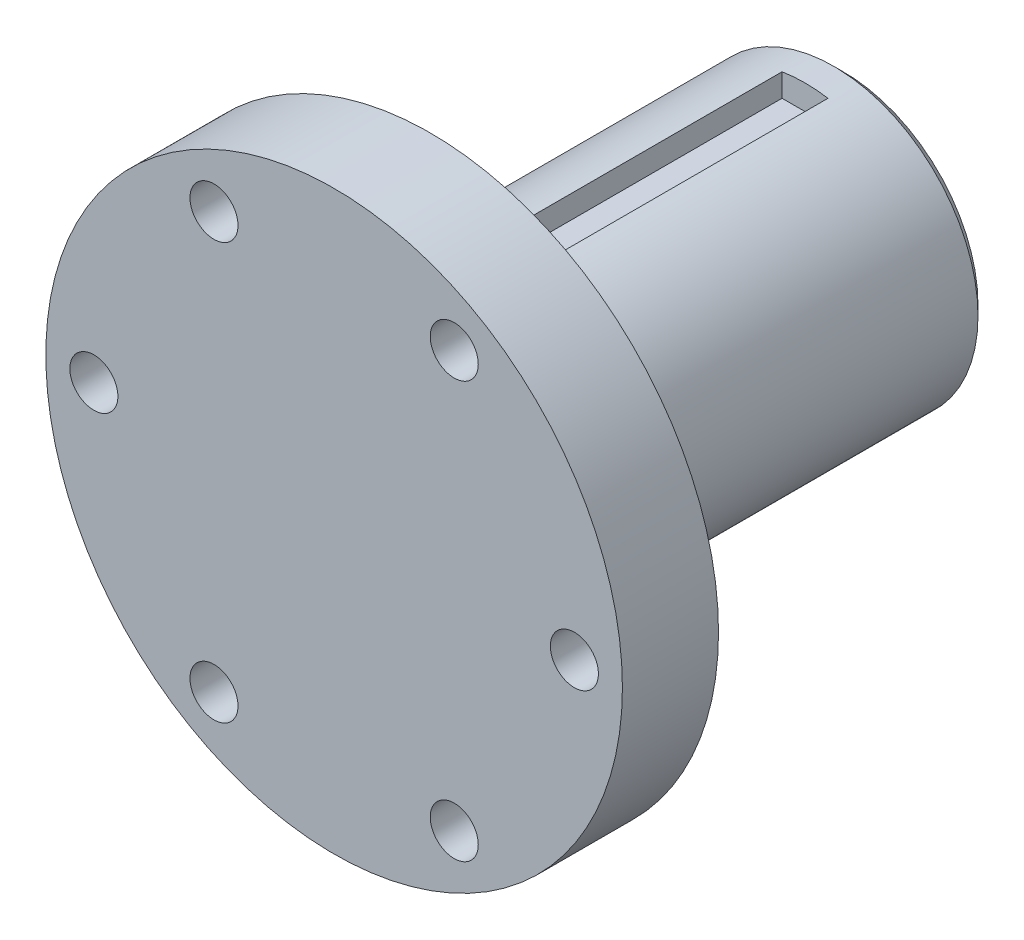
ISO-10303-21;
HEADER;
FILE_DESCRIPTION(('STEP AP214'),'2;1');
FILE_NAME('part.step','',(''),(''),'','','');
FILE_SCHEMA(('AUTOMOTIVE_DESIGN { 1 0 10303 214 1 1 1 1 }'));
ENDSEC;
DATA;
#1=APPLICATION_CONTEXT('core data for automotive mechanical design processes');
#2=APPLICATION_PROTOCOL_DEFINITION('international standard','automotive_design',2000,#1);
#3=PRODUCT_CONTEXT('',#1,'mechanical');
#4=PRODUCT('Part','Part','',(#3));
#5=PRODUCT_RELATED_PRODUCT_CATEGORY('part','',(#4));
#6=PRODUCT_DEFINITION_FORMATION('','',#4);
#7=PRODUCT_DEFINITION_CONTEXT('part definition',#1,'design');
#8=PRODUCT_DEFINITION('design','',#6,#7);
#9=PRODUCT_DEFINITION_SHAPE('','',#8);
#10=(LENGTH_UNIT() NAMED_UNIT(*) SI_UNIT(.MILLI.,.METRE.));
#11=(NAMED_UNIT(*) PLANE_ANGLE_UNIT() SI_UNIT($,.RADIAN.));
#12=(NAMED_UNIT(*) SI_UNIT($,.STERADIAN.) SOLID_ANGLE_UNIT());
#13=UNCERTAINTY_MEASURE_WITH_UNIT(LENGTH_MEASURE(1.E-05),#10,'distance_accuracy_value','');
#14=(GEOMETRIC_REPRESENTATION_CONTEXT(3) GLOBAL_UNCERTAINTY_ASSIGNED_CONTEXT((#13)) GLOBAL_UNIT_ASSIGNED_CONTEXT((#10,
#11,#12)) REPRESENTATION_CONTEXT('',''));
#15=CARTESIAN_POINT('',(0.,0.,0.));
#16=DIRECTION('',(0.,0.,1.));
#17=DIRECTION('',(1.,0.,0.));
#18=AXIS2_PLACEMENT_3D('',#15,#16,#17);
#19=CARTESIAN_POINT('',(0.,0.,53.));
#20=DIRECTION('',(0.,0.,-1.));
#21=DIRECTION('',(-1.,0.,0.));
#22=AXIS2_PLACEMENT_3D('',#19,#20,#21);
#23=CYLINDRICAL_SURFACE('',#22,15.);
#24=CARTESIAN_POINT('',(0.,0.,39.));
#25=DIRECTION('',(0.,0.,-1.));
#26=DIRECTION('',(-1.,0.,0.));
#27=AXIS2_PLACEMENT_3D('',#24,#25,#26);
#28=CIRCLE('',#27,15.);
#29=CARTESIAN_POINT('',(-2.39,14.8083726317243,39.));
#30=VERTEX_POINT('',#29);
#31=CARTESIAN_POINT('',(2.39,14.8083726317243,39.));
#32=VERTEX_POINT('',#31);
#33=EDGE_CURVE('E100',#30,#32,#28,.T.);
#34=ORIENTED_EDGE('',*,*,#33,.F.);
#35=DIRECTION('',(0.,0.,-1.));
#36=VECTOR('',#35,1.);
#37=CARTESIAN_POINT('',(-2.39,14.8083726317243,39.));
#38=LINE('',#37,#36);
#39=CARTESIAN_POINT('',(-2.39,14.8083726317243,4.));
#40=VERTEX_POINT('',#39);
#41=EDGE_CURVE('E60',#30,#40,#38,.T.);
#42=ORIENTED_EDGE('',*,*,#41,.T.);
#43=CARTESIAN_POINT('',(0.,0.,4.));
#44=DIRECTION('',(0.,0.,-1.));
#45=DIRECTION('',(-1.,0.,0.));
#46=AXIS2_PLACEMENT_3D('',#43,#44,#45);
#47=CIRCLE('',#46,15.);
#48=CARTESIAN_POINT('',(2.39,14.8083726317243,4.));
#49=VERTEX_POINT('',#48);
#50=EDGE_CURVE('E76',#40,#49,#47,.T.);
#51=ORIENTED_EDGE('',*,*,#50,.T.);
#52=DIRECTION('',(0.,0.,-1.));
#53=VECTOR('',#52,1.);
#54=CARTESIAN_POINT('',(2.39,14.8083726317243,39.));
#55=LINE('',#54,#53);
#56=EDGE_CURVE('E90',#32,#49,#55,.T.);
#57=ORIENTED_EDGE('',*,*,#56,.F.);
#58=EDGE_LOOP('',(#34,#42,#51,#57));
#59=FACE_BOUND('',#58,.T.);
#60=CARTESIAN_POINT('',(0.,0.,0.999999999999994));
#61=DIRECTION('',(0.,0.,1.));
#62=DIRECTION('',(1.,0.,0.));
#63=AXIS2_PLACEMENT_3D('',#60,#61,#62);
#64=CIRCLE('',#63,15.);
#65=CARTESIAN_POINT('',(15.,0.,0.999999999999994));
#66=VERTEX_POINT('',#65);
#67=EDGE_CURVE('E115',#66,#66,#64,.T.);
#68=ORIENTED_EDGE('',*,*,#67,.T.);
#69=EDGE_LOOP('',(#68));
#70=FACE_BOUND('',#69,.T.);
#71=CARTESIAN_POINT('',(0.,0.,43.));
#72=DIRECTION('',(0.,0.,1.));
#73=DIRECTION('',(1.,0.,0.));
#74=AXIS2_PLACEMENT_3D('',#71,#72,#73);
#75=CIRCLE('',#74,15.);
#76=CARTESIAN_POINT('',(15.,0.,43.));
#77=VERTEX_POINT('',#76);
#78=EDGE_CURVE('E11',#77,#77,#75,.T.);
#79=ORIENTED_EDGE('',*,*,#78,.F.);
#80=EDGE_LOOP('',(#79));
#81=FACE_BOUND('',#80,.T.);
#82=ADVANCED_FACE('F35',(#59,#70,#81),#23,.T.);
#83=CARTESIAN_POINT('',(0.,0.,0.));
#84=DIRECTION('',(0.,0.,1.));
#85=DIRECTION('',(1.,0.,0.));
#86=AXIS2_PLACEMENT_3D('',#83,#84,#85);
#87=PLANE('',#86);
#88=CARTESIAN_POINT('',(0.,0.,0.));
#89=DIRECTION('',(0.,0.,1.));
#90=DIRECTION('',(1.,0.,0.));
#91=AXIS2_PLACEMENT_3D('',#88,#89,#90);
#92=CIRCLE('',#91,14.);
#93=CARTESIAN_POINT('',(14.,0.,0.));
#94=VERTEX_POINT('',#93);
#95=EDGE_CURVE('E44',#94,#94,#92,.F.);
#96=ORIENTED_EDGE('',*,*,#95,.T.);
#97=EDGE_LOOP('',(#96));
#98=FACE_BOUND('',#97,.T.);
#99=ADVANCED_FACE('F122',(#98),#87,.F.);
#100=CARTESIAN_POINT('',(0.,0.,0.999999999999994));
#101=DIRECTION('',(0.,0.,1.));
#102=DIRECTION('',(1.,0.,0.));
#103=AXIS2_PLACEMENT_3D('',#100,#101,#102);
#104=CONICAL_SURFACE('',#103,15.,0.785398163397451);
#105=ORIENTED_EDGE('',*,*,#95,.F.);
#106=EDGE_LOOP('',(#105));
#107=FACE_BOUND('',#106,.T.);
#108=ORIENTED_EDGE('',*,*,#67,.F.);
#109=EDGE_LOOP('',(#108));
#110=FACE_BOUND('',#109,.T.);
#111=ADVANCED_FACE('F38',(#107,#110),#104,.T.);
#112=CARTESIAN_POINT('',(-2.39,12.4183726317243,39.));
#113=DIRECTION('',(-1.,0.,0.));
#114=DIRECTION('',(0.,-1.,0.));
#115=AXIS2_PLACEMENT_3D('',#112,#113,#114);
#116=PLANE('',#115);
#117=DIRECTION('',(0.,1.,0.));
#118=VECTOR('',#117,1.);
#119=CARTESIAN_POINT('',(-2.39,12.4183726317243,4.));
#120=LINE('',#119,#118);
#121=CARTESIAN_POINT('',(-2.39,12.4183726317243,4.));
#122=VERTEX_POINT('',#121);
#123=EDGE_CURVE('E103',#122,#40,#120,.T.);
#124=ORIENTED_EDGE('',*,*,#123,.T.);
#125=ORIENTED_EDGE('',*,*,#41,.F.);
#126=DIRECTION('',(0.,1.,0.));
#127=VECTOR('',#126,1.);
#128=CARTESIAN_POINT('',(-2.39,12.4183726317243,39.));
#129=LINE('',#128,#127);
#130=CARTESIAN_POINT('',(-2.39,12.4183726317243,39.));
#131=VERTEX_POINT('',#130);
#132=EDGE_CURVE('E96',#131,#30,#129,.T.);
#133=ORIENTED_EDGE('',*,*,#132,.F.);
#134=DIRECTION('',(0.,0.,-1.));
#135=VECTOR('',#134,1.);
#136=CARTESIAN_POINT('',(-2.39,12.4183726317243,39.));
#137=LINE('',#136,#135);
#138=EDGE_CURVE('E89',#131,#122,#137,.T.);
#139=ORIENTED_EDGE('',*,*,#138,.T.);
#140=EDGE_LOOP('',(#124,#125,#133,#139));
#141=FACE_BOUND('',#140,.T.);
#142=ADVANCED_FACE('F126',(#141),#116,.F.);
#143=CARTESIAN_POINT('',(2.39,12.4183726317243,39.));
#144=DIRECTION('',(0.,-1.,0.));
#145=DIRECTION('',(0.,0.,-1.));
#146=AXIS2_PLACEMENT_3D('',#143,#144,#145);
#147=PLANE('',#146);
#148=DIRECTION('',(-1.,0.,0.));
#149=VECTOR('',#148,1.);
#150=CARTESIAN_POINT('',(2.39,12.4183726317243,4.));
#151=LINE('',#150,#149);
#152=CARTESIAN_POINT('',(2.39,12.4183726317243,4.));
#153=VERTEX_POINT('',#152);
#154=EDGE_CURVE('E111',#153,#122,#151,.T.);
#155=ORIENTED_EDGE('',*,*,#154,.T.);
#156=ORIENTED_EDGE('',*,*,#138,.F.);
#157=DIRECTION('',(-1.,0.,0.));
#158=VECTOR('',#157,1.);
#159=CARTESIAN_POINT('',(2.39,12.4183726317243,39.));
#160=LINE('',#159,#158);
#161=CARTESIAN_POINT('',(2.39,12.4183726317243,39.));
#162=VERTEX_POINT('',#161);
#163=EDGE_CURVE('E93',#162,#131,#160,.T.);
#164=ORIENTED_EDGE('',*,*,#163,.F.);
#165=DIRECTION('',(0.,0.,-1.));
#166=VECTOR('',#165,1.);
#167=CARTESIAN_POINT('',(2.39,12.4183726317243,39.));
#168=LINE('',#167,#166);
#169=EDGE_CURVE('E84',#162,#153,#168,.T.);
#170=ORIENTED_EDGE('',*,*,#169,.T.);
#171=EDGE_LOOP('',(#155,#156,#164,#170));
#172=FACE_BOUND('',#171,.T.);
#173=ADVANCED_FACE('F94',(#172),#147,.F.);
#174=CARTESIAN_POINT('',(2.39,14.8083726317243,39.));
#175=DIRECTION('',(1.,0.,0.));
#176=DIRECTION('',(0.,1.,0.));
#177=AXIS2_PLACEMENT_3D('',#174,#175,#176);
#178=PLANE('',#177);
#179=DIRECTION('',(0.,-1.,0.));
#180=VECTOR('',#179,1.);
#181=CARTESIAN_POINT('',(2.39,14.8083726317243,4.));
#182=LINE('',#181,#180);
#183=EDGE_CURVE('E51',#49,#153,#182,.T.);
#184=ORIENTED_EDGE('',*,*,#183,.T.);
#185=ORIENTED_EDGE('',*,*,#169,.F.);
#186=DIRECTION('',(0.,-1.,0.));
#187=VECTOR('',#186,1.);
#188=CARTESIAN_POINT('',(2.39,14.8083726317243,39.));
#189=LINE('',#188,#187);
#190=EDGE_CURVE('E82',#32,#162,#189,.T.);
#191=ORIENTED_EDGE('',*,*,#190,.F.);
#192=ORIENTED_EDGE('',*,*,#56,.T.);
#193=EDGE_LOOP('',(#184,#185,#191,#192));
#194=FACE_BOUND('',#193,.T.);
#195=ADVANCED_FACE('F86',(#194),#178,.F.);
#196=CARTESIAN_POINT('',(0.,0.,39.));
#197=DIRECTION('',(0.,0.,-1.));
#198=DIRECTION('',(-1.,0.,0.));
#199=AXIS2_PLACEMENT_3D('',#196,#197,#198);
#200=PLANE('',#199);
#201=ORIENTED_EDGE('',*,*,#33,.T.);
#202=ORIENTED_EDGE('',*,*,#190,.T.);
#203=ORIENTED_EDGE('',*,*,#163,.T.);
#204=ORIENTED_EDGE('',*,*,#132,.T.);
#205=EDGE_LOOP('',(#201,#202,#203,#204));
#206=FACE_BOUND('',#205,.T.);
#207=ADVANCED_FACE('F98',(#206),#200,.T.);
#208=CARTESIAN_POINT('',(0.,0.,4.));
#209=DIRECTION('',(0.,0.,-1.));
#210=DIRECTION('',(-1.,0.,0.));
#211=AXIS2_PLACEMENT_3D('',#208,#209,#210);
#212=PLANE('',#211);
#213=ORIENTED_EDGE('',*,*,#50,.F.);
#214=ORIENTED_EDGE('',*,*,#123,.F.);
#215=ORIENTED_EDGE('',*,*,#154,.F.);
#216=ORIENTED_EDGE('',*,*,#183,.F.);
#217=EDGE_LOOP('',(#213,#214,#215,#216));
#218=FACE_BOUND('',#217,.T.);
#219=ADVANCED_FACE('F217',(#218),#212,.F.);
#220=CARTESIAN_POINT('',(0.,0.,43.));
#221=DIRECTION('',(0.,0.,1.));
#222=DIRECTION('',(1.,0.,0.));
#223=AXIS2_PLACEMENT_3D('',#220,#221,#222);
#224=CYLINDRICAL_SURFACE('',#223,30.);
#225=CARTESIAN_POINT('',(0.,0.,43.));
#226=DIRECTION('',(0.,0.,1.));
#227=DIRECTION('',(1.,0.,0.));
#228=AXIS2_PLACEMENT_3D('',#225,#226,#227);
#229=CIRCLE('',#228,30.);
#230=CARTESIAN_POINT('',(30.,0.,43.));
#231=VERTEX_POINT('',#230);
#232=EDGE_CURVE('E109',#231,#231,#229,.T.);
#233=ORIENTED_EDGE('',*,*,#232,.T.);
#234=EDGE_LOOP('',(#233));
#235=FACE_BOUND('',#234,.T.);
#236=CARTESIAN_POINT('',(0.,0.,53.));
#237=DIRECTION('',(0.,0.,1.));
#238=DIRECTION('',(1.,0.,0.));
#239=AXIS2_PLACEMENT_3D('',#236,#237,#238);
#240=CIRCLE('',#239,30.);
#241=CARTESIAN_POINT('',(30.,0.,53.));
#242=VERTEX_POINT('',#241);
#243=EDGE_CURVE('E144',#242,#242,#240,.T.);
#244=ORIENTED_EDGE('',*,*,#243,.F.);
#245=EDGE_LOOP('',(#244));
#246=FACE_BOUND('',#245,.T.);
#247=ADVANCED_FACE('F138',(#235,#246),#224,.T.);
#248=CARTESIAN_POINT('',(0.,0.,43.));
#249=DIRECTION('',(0.,0.,1.));
#250=DIRECTION('',(1.,0.,0.));
#251=AXIS2_PLACEMENT_3D('',#248,#249,#250);
#252=PLANE('',#251);
#253=CARTESIAN_POINT('',(12.5000000000003,-21.6506350946108,43.));
#254=DIRECTION('',(0.,0.,-1.));
#255=DIRECTION('',(-0.50000000000001,0.866025403784433,0.));
#256=AXIS2_PLACEMENT_3D('',#253,#254,#255);
#257=CIRCLE('',#256,2.5);
#258=CARTESIAN_POINT('',(11.2500000000002,-19.4855715851497,43.));
#259=VERTEX_POINT('',#258);
#260=EDGE_CURVE('E161',#259,#259,#257,.T.);
#261=ORIENTED_EDGE('',*,*,#260,.F.);
#262=EDGE_LOOP('',(#261));
#263=FACE_BOUND('',#262,.T.);
#264=CARTESIAN_POINT('',(-12.4999999999998,-21.6506350946111,43.));
#265=DIRECTION('',(0.,0.,-1.));
#266=DIRECTION('',(0.499999999999992,0.866025403784443,0.));
#267=AXIS2_PLACEMENT_3D('',#264,#265,#266);
#268=CIRCLE('',#267,2.5);
#269=CARTESIAN_POINT('',(-11.2499999999998,-19.48557158515,43.));
#270=VERTEX_POINT('',#269);
#271=EDGE_CURVE('E167',#270,#270,#268,.T.);
#272=ORIENTED_EDGE('',*,*,#271,.F.);
#273=EDGE_LOOP('',(#272));
#274=FACE_BOUND('',#273,.T.);
#275=CARTESIAN_POINT('',(-25.,0.,43.));
#276=DIRECTION('',(0.,0.,-1.));
#277=DIRECTION('',(1.,0.,0.));
#278=AXIS2_PLACEMENT_3D('',#275,#276,#277);
#279=CIRCLE('',#278,2.5);
#280=CARTESIAN_POINT('',(-22.5,0.,43.));
#281=VERTEX_POINT('',#280);
#282=EDGE_CURVE('E173',#281,#281,#279,.T.);
#283=ORIENTED_EDGE('',*,*,#282,.F.);
#284=EDGE_LOOP('',(#283));
#285=FACE_BOUND('',#284,.T.);
#286=CARTESIAN_POINT('',(-12.5000000000001,21.6506350946109,43.));
#287=DIRECTION('',(0.,0.,-1.));
#288=DIRECTION('',(0.500000000000004,-0.866025403784436,0.));
#289=AXIS2_PLACEMENT_3D('',#286,#287,#288);
#290=CIRCLE('',#289,2.5);
#291=CARTESIAN_POINT('',(-11.2500000000001,19.4855715851498,43.));
#292=VERTEX_POINT('',#291);
#293=EDGE_CURVE('E179',#292,#292,#290,.T.);
#294=ORIENTED_EDGE('',*,*,#293,.F.);
#295=EDGE_LOOP('',(#294));
#296=FACE_BOUND('',#295,.T.);
#297=CARTESIAN_POINT('',(12.5,21.650635094611,43.));
#298=DIRECTION('',(0.,0.,-1.));
#299=DIRECTION('',(-0.499999999999998,-0.86602540378444,0.));
#300=AXIS2_PLACEMENT_3D('',#297,#298,#299);
#301=CIRCLE('',#300,2.5);
#302=CARTESIAN_POINT('',(11.25,19.4855715851499,43.));
#303=VERTEX_POINT('',#302);
#304=EDGE_CURVE('E155',#303,#303,#301,.T.);
#305=ORIENTED_EDGE('',*,*,#304,.F.);
#306=EDGE_LOOP('',(#305));
#307=FACE_BOUND('',#306,.T.);
#308=CARTESIAN_POINT('',(25.,0.,43.));
#309=DIRECTION('',(0.,0.,-1.));
#310=DIRECTION('',(-1.,0.,0.));
#311=AXIS2_PLACEMENT_3D('',#308,#309,#310);
#312=CIRCLE('',#311,2.5);
#313=CARTESIAN_POINT('',(22.5,0.,43.));
#314=VERTEX_POINT('',#313);
#315=EDGE_CURVE('E149',#314,#314,#312,.T.);
#316=ORIENTED_EDGE('',*,*,#315,.F.);
#317=EDGE_LOOP('',(#316));
#318=FACE_BOUND('',#317,.T.);
#319=ORIENTED_EDGE('',*,*,#78,.T.);
#320=EDGE_LOOP('',(#319));
#321=FACE_BOUND('',#320,.T.);
#322=ORIENTED_EDGE('',*,*,#232,.F.);
#323=EDGE_LOOP('',(#322));
#324=FACE_BOUND('',#323,.T.);
#325=ADVANCED_FACE('F134',(#263,#274,#285,#296,#307,#318,#321,#324),#252,.F.);
#326=CARTESIAN_POINT('',(0.,0.,53.));
#327=DIRECTION('',(0.,0.,1.));
#328=DIRECTION('',(1.,0.,0.));
#329=AXIS2_PLACEMENT_3D('',#326,#327,#328);
#330=PLANE('',#329);
#331=CARTESIAN_POINT('',(12.5000000000003,-21.6506350946108,53.));
#332=DIRECTION('',(0.,0.,-1.));
#333=DIRECTION('',(-0.50000000000001,0.866025403784433,0.));
#334=AXIS2_PLACEMENT_3D('',#331,#332,#333);
#335=CIRCLE('',#334,2.5);
#336=CARTESIAN_POINT('',(11.2500000000002,-19.4855715851497,53.));
#337=VERTEX_POINT('',#336);
#338=EDGE_CURVE('E164',#337,#337,#335,.T.);
#339=ORIENTED_EDGE('',*,*,#338,.T.);
#340=EDGE_LOOP('',(#339));
#341=FACE_BOUND('',#340,.T.);
#342=CARTESIAN_POINT('',(-12.4999999999998,-21.6506350946111,53.));
#343=DIRECTION('',(0.,0.,-1.));
#344=DIRECTION('',(0.499999999999992,0.866025403784443,0.));
#345=AXIS2_PLACEMENT_3D('',#342,#343,#344);
#346=CIRCLE('',#345,2.5);
#347=CARTESIAN_POINT('',(-11.2499999999998,-19.48557158515,53.));
#348=VERTEX_POINT('',#347);
#349=EDGE_CURVE('E170',#348,#348,#346,.T.);
#350=ORIENTED_EDGE('',*,*,#349,.T.);
#351=EDGE_LOOP('',(#350));
#352=FACE_BOUND('',#351,.T.);
#353=CARTESIAN_POINT('',(-25.,0.,53.));
#354=DIRECTION('',(0.,0.,-1.));
#355=DIRECTION('',(1.,0.,0.));
#356=AXIS2_PLACEMENT_3D('',#353,#354,#355);
#357=CIRCLE('',#356,2.5);
#358=CARTESIAN_POINT('',(-22.5,0.,53.));
#359=VERTEX_POINT('',#358);
#360=EDGE_CURVE('E176',#359,#359,#357,.T.);
#361=ORIENTED_EDGE('',*,*,#360,.T.);
#362=EDGE_LOOP('',(#361));
#363=FACE_BOUND('',#362,.T.);
#364=CARTESIAN_POINT('',(-12.5000000000001,21.6506350946109,53.));
#365=DIRECTION('',(0.,0.,-1.));
#366=DIRECTION('',(0.500000000000004,-0.866025403784436,0.));
#367=AXIS2_PLACEMENT_3D('',#364,#365,#366);
#368=CIRCLE('',#367,2.5);
#369=CARTESIAN_POINT('',(-11.2500000000001,19.4855715851498,53.));
#370=VERTEX_POINT('',#369);
#371=EDGE_CURVE('E158',#370,#370,#368,.T.);
#372=ORIENTED_EDGE('',*,*,#371,.T.);
#373=EDGE_LOOP('',(#372));
#374=FACE_BOUND('',#373,.T.);
#375=CARTESIAN_POINT('',(12.5,21.650635094611,53.));
#376=DIRECTION('',(0.,0.,-1.));
#377=DIRECTION('',(-0.499999999999998,-0.86602540378444,0.));
#378=AXIS2_PLACEMENT_3D('',#375,#376,#377);
#379=CIRCLE('',#378,2.5);
#380=CARTESIAN_POINT('',(11.25,19.4855715851499,53.));
#381=VERTEX_POINT('',#380);
#382=EDGE_CURVE('E152',#381,#381,#379,.T.);
#383=ORIENTED_EDGE('',*,*,#382,.T.);
#384=EDGE_LOOP('',(#383));
#385=FACE_BOUND('',#384,.T.);
#386=CARTESIAN_POINT('',(25.,0.,53.));
#387=DIRECTION('',(0.,0.,-1.));
#388=DIRECTION('',(-1.,0.,0.));
#389=AXIS2_PLACEMENT_3D('',#386,#387,#388);
#390=CIRCLE('',#389,2.5);
#391=CARTESIAN_POINT('',(22.5,0.,53.));
#392=VERTEX_POINT('',#391);
#393=EDGE_CURVE('E147',#392,#392,#390,.T.);
#394=ORIENTED_EDGE('',*,*,#393,.T.);
#395=EDGE_LOOP('',(#394));
#396=FACE_BOUND('',#395,.T.);
#397=ORIENTED_EDGE('',*,*,#243,.T.);
#398=EDGE_LOOP('',(#397));
#399=FACE_BOUND('',#398,.T.);
#400=ADVANCED_FACE('F137',(#341,#352,#363,#374,#385,#396,#399),#330,.T.);
#401=CARTESIAN_POINT('',(25.,0.,53.));
#402=DIRECTION('',(0.,0.,-1.));
#403=DIRECTION('',(-1.,0.,0.));
#404=AXIS2_PLACEMENT_3D('',#401,#402,#403);
#405=CYLINDRICAL_SURFACE('',#404,2.5);
#406=ORIENTED_EDGE('',*,*,#393,.F.);
#407=EDGE_LOOP('',(#406));
#408=FACE_BOUND('',#407,.T.);
#409=ORIENTED_EDGE('',*,*,#315,.T.);
#410=EDGE_LOOP('',(#409));
#411=FACE_BOUND('',#410,.T.);
#412=ADVANCED_FACE('F200',(#408,#411),#405,.F.);
#413=CARTESIAN_POINT('',(12.5,21.650635094611,53.));
#414=DIRECTION('',(0.,0.,-1.));
#415=DIRECTION('',(-1.,0.,0.));
#416=AXIS2_PLACEMENT_3D('',#413,#414,#415);
#417=CYLINDRICAL_SURFACE('',#416,2.5);
#418=ORIENTED_EDGE('',*,*,#382,.F.);
#419=EDGE_LOOP('',(#418));
#420=FACE_BOUND('',#419,.T.);
#421=ORIENTED_EDGE('',*,*,#304,.T.);
#422=EDGE_LOOP('',(#421));
#423=FACE_BOUND('',#422,.T.);
#424=ADVANCED_FACE('F191',(#420,#423),#417,.F.);
#425=CARTESIAN_POINT('',(-12.5000000000001,21.6506350946109,53.));
#426=DIRECTION('',(0.,0.,-1.));
#427=DIRECTION('',(-1.,0.,0.));
#428=AXIS2_PLACEMENT_3D('',#425,#426,#427);
#429=CYLINDRICAL_SURFACE('',#428,2.5);
#430=ORIENTED_EDGE('',*,*,#371,.F.);
#431=EDGE_LOOP('',(#430));
#432=FACE_BOUND('',#431,.T.);
#433=ORIENTED_EDGE('',*,*,#293,.T.);
#434=EDGE_LOOP('',(#433));
#435=FACE_BOUND('',#434,.T.);
#436=ADVANCED_FACE('F187',(#432,#435),#429,.F.);
#437=CARTESIAN_POINT('',(-25.,0.,53.));
#438=DIRECTION('',(0.,0.,-1.));
#439=DIRECTION('',(-1.,0.,0.));
#440=AXIS2_PLACEMENT_3D('',#437,#438,#439);
#441=CYLINDRICAL_SURFACE('',#440,2.5);
#442=ORIENTED_EDGE('',*,*,#360,.F.);
#443=EDGE_LOOP('',(#442));
#444=FACE_BOUND('',#443,.T.);
#445=ORIENTED_EDGE('',*,*,#282,.T.);
#446=EDGE_LOOP('',(#445));
#447=FACE_BOUND('',#446,.T.);
#448=ADVANCED_FACE('F190',(#444,#447),#441,.F.);
#449=CARTESIAN_POINT('',(-12.4999999999998,-21.6506350946111,53.));
#450=DIRECTION('',(0.,0.,-1.));
#451=DIRECTION('',(-1.,0.,0.));
#452=AXIS2_PLACEMENT_3D('',#449,#450,#451);
#453=CYLINDRICAL_SURFACE('',#452,2.5);
#454=ORIENTED_EDGE('',*,*,#349,.F.);
#455=EDGE_LOOP('',(#454));
#456=FACE_BOUND('',#455,.T.);
#457=ORIENTED_EDGE('',*,*,#271,.T.);
#458=EDGE_LOOP('',(#457));
#459=FACE_BOUND('',#458,.T.);
#460=ADVANCED_FACE('F292',(#456,#459),#453,.F.);
#461=CARTESIAN_POINT('',(12.5000000000003,-21.6506350946108,53.));
#462=DIRECTION('',(0.,0.,-1.));
#463=DIRECTION('',(-1.,0.,0.));
#464=AXIS2_PLACEMENT_3D('',#461,#462,#463);
#465=CYLINDRICAL_SURFACE('',#464,2.5);
#466=ORIENTED_EDGE('',*,*,#338,.F.);
#467=EDGE_LOOP('',(#466));
#468=FACE_BOUND('',#467,.T.);
#469=ORIENTED_EDGE('',*,*,#260,.T.);
#470=EDGE_LOOP('',(#469));
#471=FACE_BOUND('',#470,.T.);
#472=ADVANCED_FACE('F302',(#468,#471),#465,.F.);
#473=CLOSED_SHELL('',(#82,#99,#111,#142,#173,#195,#207,#219,#247,#325,#400,#412,#424,#436,#448,
#460,#472));
#474=MANIFOLD_SOLID_BREP('B2',#473);
#475=ADVANCED_BREP_SHAPE_REPRESENTATION('',(#18,#474),#14);
#476=SHAPE_DEFINITION_REPRESENTATION(#9,#475);
ENDSEC;
END-ISO-10303-21;
